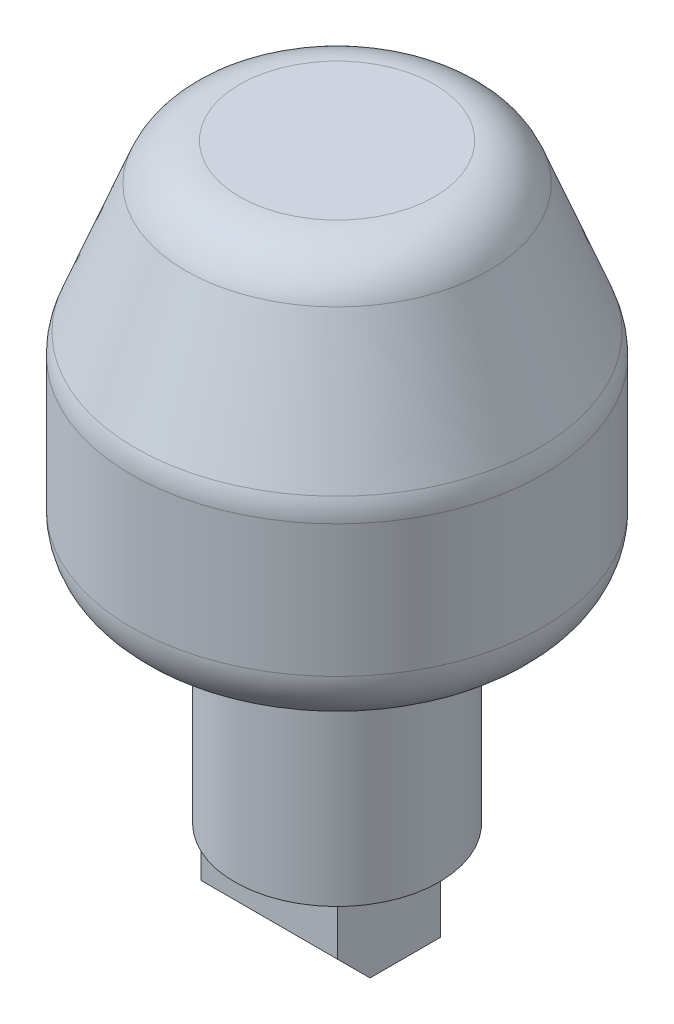
ISO-10303-21;
HEADER;
FILE_DESCRIPTION(('STEP AP214'),'2;1');
FILE_NAME('part.step','',(''),(''),'','','');
FILE_SCHEMA(('AUTOMOTIVE_DESIGN { 1 0 10303 214 1 1 1 1 }'));
ENDSEC;
DATA;
#1=APPLICATION_CONTEXT('core data for automotive mechanical design processes');
#2=APPLICATION_PROTOCOL_DEFINITION('international standard','automotive_design',2000,#1);
#3=PRODUCT_CONTEXT('',#1,'mechanical');
#4=PRODUCT('Part','Part','',(#3));
#5=PRODUCT_RELATED_PRODUCT_CATEGORY('part','',(#4));
#6=PRODUCT_DEFINITION_FORMATION('','',#4);
#7=PRODUCT_DEFINITION_CONTEXT('part definition',#1,'design');
#8=PRODUCT_DEFINITION('design','',#6,#7);
#9=PRODUCT_DEFINITION_SHAPE('','',#8);
#10=(LENGTH_UNIT() NAMED_UNIT(*) SI_UNIT(.MILLI.,.METRE.));
#11=(NAMED_UNIT(*) PLANE_ANGLE_UNIT() SI_UNIT($,.RADIAN.));
#12=(NAMED_UNIT(*) SI_UNIT($,.STERADIAN.) SOLID_ANGLE_UNIT());
#13=UNCERTAINTY_MEASURE_WITH_UNIT(LENGTH_MEASURE(1.E-05),#10,'distance_accuracy_value','');
#14=(GEOMETRIC_REPRESENTATION_CONTEXT(3) GLOBAL_UNCERTAINTY_ASSIGNED_CONTEXT((#13)) GLOBAL_UNIT_ASSIGNED_CONTEXT((#10,
#11,#12)) REPRESENTATION_CONTEXT('',''));
#15=CARTESIAN_POINT('',(0.,0.,0.));
#16=DIRECTION('',(0.,0.,1.));
#17=DIRECTION('',(1.,0.,0.));
#18=AXIS2_PLACEMENT_3D('',#15,#16,#17);
#19=CARTESIAN_POINT('',(0.,-23.4188,0.));
#20=DIRECTION('',(0.,-1.,0.));
#21=DIRECTION('',(0.,0.,-1.));
#22=AXIS2_PLACEMENT_3D('',#19,#20,#21);
#23=PLANE('',#22);
#24=CARTESIAN_POINT('',(0.,-23.4188,0.));
#25=DIRECTION('',(0.,-1.,0.));
#26=DIRECTION('',(0.,0.,-1.));
#27=AXIS2_PLACEMENT_3D('',#24,#25,#26);
#28=CIRCLE('',#27,11.176);
#29=CARTESIAN_POINT('',(0.,-23.4188,-11.176));
#30=VERTEX_POINT('',#29);
#31=EDGE_CURVE('E336',#30,#30,#28,.T.);
#32=ORIENTED_EDGE('',*,*,#31,.T.);
#33=EDGE_LOOP('',(#32));
#34=FACE_BOUND('',#33,.T.);
#35=DIRECTION('',(-1.,0.,0.));
#36=VECTOR('',#35,1.);
#37=CARTESIAN_POINT('',(-7.4549,-23.4188,7.4041));
#38=LINE('',#37,#36);
#39=CARTESIAN_POINT('',(7.4549,-23.4188,7.4041));
#40=VERTEX_POINT('',#39);
#41=CARTESIAN_POINT('',(-7.4549,-23.4188,7.4041));
#42=VERTEX_POINT('',#41);
#43=EDGE_CURVE('E320',#40,#42,#38,.T.);
#44=ORIENTED_EDGE('',*,*,#43,.F.);
#45=DIRECTION('',(0.,0.,1.));
#46=VECTOR('',#45,1.);
#47=CARTESIAN_POINT('',(7.4549,-23.4188,7.4041));
#48=LINE('',#47,#46);
#49=CARTESIAN_POINT('',(7.4549,-23.4188,-3.8481));
#50=VERTEX_POINT('',#49);
#51=EDGE_CURVE('E302',#50,#40,#48,.T.);
#52=ORIENTED_EDGE('',*,*,#51,.F.);
#53=DIRECTION('',(1.,0.,0.));
#54=VECTOR('',#53,1.);
#55=CARTESIAN_POINT('',(7.4549,-23.4188,-3.8481));
#56=LINE('',#55,#54);
#57=CARTESIAN_POINT('',(-7.4549,-23.4188,-3.8481));
#58=VERTEX_POINT('',#57);
#59=EDGE_CURVE('E313',#58,#50,#56,.T.);
#60=ORIENTED_EDGE('',*,*,#59,.F.);
#61=DIRECTION('',(0.,0.,-1.));
#62=VECTOR('',#61,1.);
#63=CARTESIAN_POINT('',(-7.4549,-23.4188,-3.8481));
#64=LINE('',#63,#62);
#65=EDGE_CURVE('E323',#42,#58,#64,.T.);
#66=ORIENTED_EDGE('',*,*,#65,.F.);
#67=EDGE_LOOP('',(#44,#52,#60,#66));
#68=FACE_BOUND('',#67,.T.);
#69=ADVANCED_FACE('F36',(#34,#68),#23,.T.);
#70=CARTESIAN_POINT('',(22.479,0.,0.));
#71=DIRECTION('',(0.,-1.,0.));
#72=DIRECTION('',(0.,0.,-1.));
#73=AXIS2_PLACEMENT_3D('',#70,#71,#72);
#74=PLANE('',#73);
#75=CARTESIAN_POINT('',(0.,0.,0.));
#76=DIRECTION('',(0.,-1.,0.));
#77=DIRECTION('',(0.,0.,-1.));
#78=AXIS2_PLACEMENT_3D('',#75,#76,#77);
#79=CIRCLE('',#78,16.129);
#80=CARTESIAN_POINT('',(0.,0.,-16.129));
#81=VERTEX_POINT('',#80);
#82=EDGE_CURVE('E44',#81,#81,#79,.T.);
#83=ORIENTED_EDGE('',*,*,#82,.T.);
#84=EDGE_LOOP('',(#83));
#85=FACE_BOUND('',#84,.T.);
#86=CARTESIAN_POINT('',(0.,0.,0.));
#87=DIRECTION('',(0.,-1.,0.));
#88=DIRECTION('',(0.,0.,-1.));
#89=AXIS2_PLACEMENT_3D('',#86,#87,#88);
#90=CIRCLE('',#89,11.176);
#91=CARTESIAN_POINT('',(-1.778,0.,11.0336617675185));
#92=VERTEX_POINT('',#91);
#93=CARTESIAN_POINT('',(1.778,0.,11.0336617675185));
#94=VERTEX_POINT('',#93);
#95=EDGE_CURVE('E335',#92,#94,#90,.T.);
#96=ORIENTED_EDGE('',*,*,#95,.F.);
#97=DIRECTION('',(0.,0.,1.));
#98=VECTOR('',#97,1.);
#99=CARTESIAN_POINT('',(-1.778,0.,0.));
#100=LINE('',#99,#98);
#101=CARTESIAN_POINT('',(-1.778,0.,14.2944088179873));
#102=VERTEX_POINT('',#101);
#103=EDGE_CURVE('E198',#92,#102,#100,.T.);
#104=ORIENTED_EDGE('',*,*,#103,.T.);
#105=DIRECTION('',(-1.,0.,0.));
#106=VECTOR('',#105,1.);
#107=CARTESIAN_POINT('',(22.479,0.,14.2944088179873));
#108=LINE('',#107,#106);
#109=CARTESIAN_POINT('',(1.778,0.,14.2944088179873));
#110=VERTEX_POINT('',#109);
#111=EDGE_CURVE('E210',#110,#102,#108,.T.);
#112=ORIENTED_EDGE('',*,*,#111,.F.);
#113=DIRECTION('',(0.,0.,1.));
#114=VECTOR('',#113,1.);
#115=CARTESIAN_POINT('',(1.778,0.,0.));
#116=LINE('',#115,#114);
#117=EDGE_CURVE('E186',#94,#110,#116,.T.);
#118=ORIENTED_EDGE('',*,*,#117,.F.);
#119=EDGE_LOOP('',(#96,#104,#112,#118));
#120=FACE_BOUND('',#119,.T.);
#121=ADVANCED_FACE('F368',(#85,#120),#74,.T.);
#122=CARTESIAN_POINT('',(0.,0.,0.));
#123=DIRECTION('',(0.,1.,0.));
#124=DIRECTION('',(0.,0.,1.));
#125=AXIS2_PLACEMENT_3D('',#122,#123,#124);
#126=CYLINDRICAL_SURFACE('',#125,22.479);
#127=CARTESIAN_POINT('',(0.,20.8013575067965,0.));
#128=DIRECTION('',(0.,-1.,0.));
#129=DIRECTION('',(0.,0.,-1.));
#130=AXIS2_PLACEMENT_3D('',#127,#128,#129);
#131=CIRCLE('',#130,22.479);
#132=CARTESIAN_POINT('',(0.,20.8013575067965,-22.479));
#133=VERTEX_POINT('',#132);
#134=EDGE_CURVE('E363',#133,#133,#131,.T.);
#135=ORIENTED_EDGE('',*,*,#134,.T.);
#136=EDGE_LOOP('',(#135));
#137=FACE_BOUND('',#136,.T.);
#138=CARTESIAN_POINT('',(0.,6.34999999999998,0.));
#139=DIRECTION('',(0.,-1.,0.));
#140=DIRECTION('',(0.,0.,-1.));
#141=AXIS2_PLACEMENT_3D('',#138,#139,#140);
#142=CIRCLE('',#141,22.479);
#143=CARTESIAN_POINT('',(0.,6.34999999999998,-22.479));
#144=VERTEX_POINT('',#143);
#145=EDGE_CURVE('E360',#144,#144,#142,.F.);
#146=ORIENTED_EDGE('',*,*,#145,.T.);
#147=EDGE_LOOP('',(#146));
#148=FACE_BOUND('',#147,.T.);
#149=ADVANCED_FACE('F377',(#137,#148),#126,.T.);
#150=CARTESIAN_POINT('',(0.,41.1988,0.));
#151=DIRECTION('',(0.,1.,0.));
#152=DIRECTION('',(0.,0.,1.));
#153=AXIS2_PLACEMENT_3D('',#150,#151,#152);
#154=PLANE('',#153);
#155=CARTESIAN_POINT('',(0.,41.1988,0.));
#156=DIRECTION('',(0.,1.,0.));
#157=DIRECTION('',(0.,0.,1.));
#158=AXIS2_PLACEMENT_3D('',#155,#156,#157);
#159=CIRCLE('',#158,10.6475245335533);
#160=CARTESIAN_POINT('',(0.,41.1988,10.6475245335533));
#161=VERTEX_POINT('',#160);
#162=EDGE_CURVE('E11',#161,#161,#159,.T.);
#163=ORIENTED_EDGE('',*,*,#162,.T.);
#164=EDGE_LOOP('',(#163));
#165=FACE_BOUND('',#164,.T.);
#166=ADVANCED_FACE('F379',(#165),#154,.T.);
#167=CARTESIAN_POINT('',(0.,41.1988,0.));
#168=DIRECTION('',(0.,-1.,0.));
#169=DIRECTION('',(0.,0.,-1.));
#170=AXIS2_PLACEMENT_3D('',#167,#168,#169);
#171=CONICAL_SURFACE('',#170,14.9860000721899,0.372039753430632);
#172=CARTESIAN_POINT('',(0.,23.1096866231787,0.));
#173=DIRECTION('',(0.,1.,0.));
#174=DIRECTION('',(0.,0.,1.));
#175=AXIS2_PLACEMENT_3D('',#172,#173,#174);
#176=CIRCLE('',#175,22.0445825317936);
#177=CARTESIAN_POINT('',(0.,23.1096866231787,22.0445825317936));
#178=VERTEX_POINT('',#177);
#179=EDGE_CURVE('E357',#178,#178,#176,.T.);
#180=ORIENTED_EDGE('',*,*,#179,.T.);
#181=EDGE_LOOP('',(#180));
#182=FACE_BOUND('',#181,.T.);
#183=CARTESIAN_POINT('',(0.,37.1571291163823,0.));
#184=DIRECTION('',(0.,1.,0.));
#185=DIRECTION('',(0.,0.,1.));
#186=AXIS2_PLACEMENT_3D('',#183,#184,#185);
#187=CIRCLE('',#186,16.5631070653469);
#188=CARTESIAN_POINT('',(0.,37.1571291163823,16.5631070653469));
#189=VERTEX_POINT('',#188);
#190=EDGE_CURVE('E354',#189,#189,#187,.F.);
#191=ORIENTED_EDGE('',*,*,#190,.T.);
#192=EDGE_LOOP('',(#191));
#193=FACE_BOUND('',#192,.T.);
#194=ADVANCED_FACE('F386',(#182,#193),#171,.T.);
#195=CARTESIAN_POINT('',(0.,-23.4188,0.));
#196=DIRECTION('',(0.,1.,0.));
#197=DIRECTION('',(0.,0.,1.));
#198=AXIS2_PLACEMENT_3D('',#195,#196,#197);
#199=CYLINDRICAL_SURFACE('',#198,11.176);
#200=DIRECTION('',(0.,1.,0.));
#201=VECTOR('',#200,1.);
#202=CARTESIAN_POINT('',(-1.778,-23.4188,11.0336617675185));
#203=LINE('',#202,#201);
#204=CARTESIAN_POINT('',(-1.778,-2.1844,11.0336617675185));
#205=VERTEX_POINT('',#204);
#206=EDGE_CURVE('E339',#92,#205,#203,.F.);
#207=ORIENTED_EDGE('',*,*,#206,.F.);
#208=ORIENTED_EDGE('',*,*,#95,.T.);
#209=DIRECTION('',(0.,1.,0.));
#210=VECTOR('',#209,1.);
#211=CARTESIAN_POINT('',(1.778,-23.4188,11.0336617675185));
#212=LINE('',#211,#210);
#213=CARTESIAN_POINT('',(1.778,-2.1844,11.0336617675185));
#214=VERTEX_POINT('',#213);
#215=EDGE_CURVE('E345',#94,#214,#212,.F.);
#216=ORIENTED_EDGE('',*,*,#215,.T.);
#217=CARTESIAN_POINT('',(0.,-2.1844,0.));
#218=DIRECTION('',(0.,-1.,0.));
#219=DIRECTION('',(0.,0.,-1.));
#220=AXIS2_PLACEMENT_3D('',#217,#218,#219);
#221=CIRCLE('',#220,11.176);
#222=EDGE_CURVE('E202',#214,#205,#221,.T.);
#223=ORIENTED_EDGE('',*,*,#222,.T.);
#224=EDGE_LOOP('',(#207,#208,#216,#223));
#225=FACE_BOUND('',#224,.T.);
#226=ORIENTED_EDGE('',*,*,#31,.F.);
#227=EDGE_LOOP('',(#226));
#228=FACE_BOUND('',#227,.T.);
#229=ADVANCED_FACE('F401',(#225,#228),#199,.T.);
#230=CARTESIAN_POINT('',(7.4549,-32.4358,7.4041));
#231=DIRECTION('',(-1.,0.,0.));
#232=DIRECTION('',(0.,0.,1.));
#233=AXIS2_PLACEMENT_3D('',#230,#231,#232);
#234=PLANE('',#233);
#235=DIRECTION('',(0.,1.,0.));
#236=VECTOR('',#235,1.);
#237=CARTESIAN_POINT('',(7.4549,-32.4358,7.4041));
#238=LINE('',#237,#236);
#239=CARTESIAN_POINT('',(7.4549,-28.8798,7.4041));
#240=VERTEX_POINT('',#239);
#241=EDGE_CURVE('E333',#240,#40,#238,.T.);
#242=ORIENTED_EDGE('',*,*,#241,.F.);
#243=DIRECTION('',(0.,0.70710678118655,0.707106781186545));
#244=VECTOR('',#243,1.);
#245=CARTESIAN_POINT('',(7.4549,-32.4358,3.84810000000004));
#246=LINE('',#245,#244);
#247=CARTESIAN_POINT('',(7.4549,-32.4358,3.84810000000004));
#248=VERTEX_POINT('',#247);
#249=EDGE_CURVE('E352',#240,#248,#246,.F.);
#250=ORIENTED_EDGE('',*,*,#249,.T.);
#251=DIRECTION('',(0.,0.,1.));
#252=VECTOR('',#251,1.);
#253=CARTESIAN_POINT('',(7.4549,-32.4358,7.4041));
#254=LINE('',#253,#252);
#255=CARTESIAN_POINT('',(7.4549,-32.4358,-3.8481));
#256=VERTEX_POINT('',#255);
#257=EDGE_CURVE('E309',#256,#248,#254,.T.);
#258=ORIENTED_EDGE('',*,*,#257,.F.);
#259=DIRECTION('',(0.,1.,0.));
#260=VECTOR('',#259,1.);
#261=CARTESIAN_POINT('',(7.4549,-32.4358,-3.8481));
#262=LINE('',#261,#260);
#263=EDGE_CURVE('E317',#256,#50,#262,.T.);
#264=ORIENTED_EDGE('',*,*,#263,.T.);
#265=ORIENTED_EDGE('',*,*,#51,.T.);
#266=EDGE_LOOP('',(#242,#250,#258,#264,#265));
#267=FACE_BOUND('',#266,.T.);
#268=ADVANCED_FACE('F399',(#267),#234,.F.);
#269=CARTESIAN_POINT('',(-7.4549,-32.4358,7.4041));
#270=DIRECTION('',(0.,0.,-1.));
#271=DIRECTION('',(0.,1.,0.));
#272=AXIS2_PLACEMENT_3D('',#269,#270,#271);
#273=PLANE('',#272);
#274=DIRECTION('',(0.,1.,0.));
#275=VECTOR('',#274,1.);
#276=CARTESIAN_POINT('',(-7.4549,-32.4358,7.4041));
#277=LINE('',#276,#275);
#278=CARTESIAN_POINT('',(-7.4549,-28.8798,7.4041));
#279=VERTEX_POINT('',#278);
#280=EDGE_CURVE('E331',#279,#42,#277,.T.);
#281=ORIENTED_EDGE('',*,*,#280,.F.);
#282=DIRECTION('',(1.,0.,0.));
#283=VECTOR('',#282,1.);
#284=CARTESIAN_POINT('',(-7.4549,-28.8798,7.4041));
#285=LINE('',#284,#283);
#286=EDGE_CURVE('E51',#279,#240,#285,.T.);
#287=ORIENTED_EDGE('',*,*,#286,.T.);
#288=ORIENTED_EDGE('',*,*,#241,.T.);
#289=ORIENTED_EDGE('',*,*,#43,.T.);
#290=EDGE_LOOP('',(#281,#287,#288,#289));
#291=FACE_BOUND('',#290,.T.);
#292=ADVANCED_FACE('F609',(#291),#273,.F.);
#293=CARTESIAN_POINT('',(-7.4549,-32.4358,-3.8481));
#294=DIRECTION('',(1.,0.,0.));
#295=DIRECTION('',(0.,0.,-1.));
#296=AXIS2_PLACEMENT_3D('',#293,#294,#295);
#297=PLANE('',#296);
#298=DIRECTION('',(0.,0.,-1.));
#299=VECTOR('',#298,1.);
#300=CARTESIAN_POINT('',(-7.4549,-32.4358,-3.8481));
#301=LINE('',#300,#299);
#302=CARTESIAN_POINT('',(-7.4549,-32.4358,3.84810000000004));
#303=VERTEX_POINT('',#302);
#304=CARTESIAN_POINT('',(-7.4549,-32.4358,-3.8481));
#305=VERTEX_POINT('',#304);
#306=EDGE_CURVE('E312',#303,#305,#301,.T.);
#307=ORIENTED_EDGE('',*,*,#306,.F.);
#308=DIRECTION('',(0.,-0.70710678118655,-0.707106781186545));
#309=VECTOR('',#308,1.);
#310=CARTESIAN_POINT('',(-7.4549,-32.4358,3.84810000000004));
#311=LINE('',#310,#309);
#312=EDGE_CURVE('E59',#303,#279,#311,.F.);
#313=ORIENTED_EDGE('',*,*,#312,.T.);
#314=ORIENTED_EDGE('',*,*,#280,.T.);
#315=ORIENTED_EDGE('',*,*,#65,.T.);
#316=DIRECTION('',(0.,1.,0.));
#317=VECTOR('',#316,1.);
#318=CARTESIAN_POINT('',(-7.4549,-32.4358,-3.8481));
#319=LINE('',#318,#317);
#320=EDGE_CURVE('E329',#305,#58,#319,.T.);
#321=ORIENTED_EDGE('',*,*,#320,.F.);
#322=EDGE_LOOP('',(#307,#313,#314,#315,#321));
#323=FACE_BOUND('',#322,.T.);
#324=ADVANCED_FACE('F602',(#323),#297,.F.);
#325=CARTESIAN_POINT('',(7.4549,-32.4358,-3.8481));
#326=DIRECTION('',(0.,0.,1.));
#327=DIRECTION('',(0.,-1.,0.));
#328=AXIS2_PLACEMENT_3D('',#325,#326,#327);
#329=PLANE('',#328);
#330=ORIENTED_EDGE('',*,*,#59,.T.);
#331=ORIENTED_EDGE('',*,*,#263,.F.);
#332=DIRECTION('',(1.,0.,0.));
#333=VECTOR('',#332,1.);
#334=CARTESIAN_POINT('',(7.4549,-32.4358,-3.8481));
#335=LINE('',#334,#333);
#336=EDGE_CURVE('E315',#305,#256,#335,.T.);
#337=ORIENTED_EDGE('',*,*,#336,.F.);
#338=ORIENTED_EDGE('',*,*,#320,.T.);
#339=EDGE_LOOP('',(#330,#331,#337,#338));
#340=FACE_BOUND('',#339,.T.);
#341=ADVANCED_FACE('F594',(#340),#329,.F.);
#342=CARTESIAN_POINT('',(7.4549,-32.4358,-3.8481));
#343=DIRECTION('',(0.,1.,0.));
#344=DIRECTION('',(0.,0.,1.));
#345=AXIS2_PLACEMENT_3D('',#342,#343,#344);
#346=PLANE('',#345);
#347=DIRECTION('',(-1.,0.,0.));
#348=VECTOR('',#347,1.);
#349=CARTESIAN_POINT('',(7.30958053593167,-32.4358,3.71194026797607));
#350=LINE('',#349,#348);
#351=CARTESIAN_POINT('',(7.30958053593167,-32.4358,3.71194026797607));
#352=VERTEX_POINT('',#351);
#353=CARTESIAN_POINT('',(2.54846666666666,-32.4358,3.71194026797607));
#354=VERTEX_POINT('',#353);
#355=EDGE_CURVE('E228',#352,#354,#350,.T.);
#356=ORIENTED_EDGE('',*,*,#355,.F.);
#357=DIRECTION('',(0.,0.,1.));
#358=VECTOR('',#357,1.);
#359=CARTESIAN_POINT('',(7.30958053593168,-32.4358,-3.71194026804881));
#360=LINE('',#359,#358);
#361=CARTESIAN_POINT('',(7.30958053593168,-32.4358,-3.71194026804881));
#362=VERTEX_POINT('',#361);
#363=EDGE_CURVE('E212',#362,#352,#360,.T.);
#364=ORIENTED_EDGE('',*,*,#363,.F.);
#365=DIRECTION('',(1.,0.,0.));
#366=VECTOR('',#365,1.);
#367=CARTESIAN_POINT('',(2.54846666666666,-32.4358,-3.71194026804881));
#368=LINE('',#367,#366);
#369=CARTESIAN_POINT('',(2.54846666666666,-32.4358,-3.71194026804881));
#370=VERTEX_POINT('',#369);
#371=EDGE_CURVE('E217',#370,#362,#368,.T.);
#372=ORIENTED_EDGE('',*,*,#371,.F.);
#373=DIRECTION('',(0.,0.,-1.));
#374=VECTOR('',#373,1.);
#375=CARTESIAN_POINT('',(2.54846666666666,-32.4358,3.71194026797607));
#376=LINE('',#375,#374);
#377=EDGE_CURVE('E231',#354,#370,#376,.T.);
#378=ORIENTED_EDGE('',*,*,#377,.F.);
#379=EDGE_LOOP('',(#356,#364,#372,#378));
#380=FACE_BOUND('',#379,.T.);
#381=DIRECTION('',(1.,0.,0.));
#382=VECTOR('',#381,1.);
#383=CARTESIAN_POINT('',(-7.3279,-32.4358,-3.71194026804881));
#384=LINE('',#383,#382);
#385=CARTESIAN_POINT('',(-7.3279,-32.4358,-3.71194026804881));
#386=VERTEX_POINT('',#385);
#387=CARTESIAN_POINT('',(-2.54846666666666,-32.4358,-3.71194026804881));
#388=VERTEX_POINT('',#387);
#389=EDGE_CURVE('E260',#386,#388,#384,.T.);
#390=ORIENTED_EDGE('',*,*,#389,.F.);
#391=DIRECTION('',(0.,0.,-1.));
#392=VECTOR('',#391,1.);
#393=CARTESIAN_POINT('',(-7.3279,-32.4358,3.71194026797607));
#394=LINE('',#393,#392);
#395=CARTESIAN_POINT('',(-7.3279,-32.4358,3.71194026797607));
#396=VERTEX_POINT('',#395);
#397=EDGE_CURVE('E238',#396,#386,#394,.T.);
#398=ORIENTED_EDGE('',*,*,#397,.F.);
#399=DIRECTION('',(-1.,0.,0.));
#400=VECTOR('',#399,1.);
#401=CARTESIAN_POINT('',(-2.54846666666666,-32.4358,3.71194026797607));
#402=LINE('',#401,#400);
#403=CARTESIAN_POINT('',(-2.54846666666666,-32.4358,3.71194026797607));
#404=VERTEX_POINT('',#403);
#405=EDGE_CURVE('E249',#404,#396,#402,.T.);
#406=ORIENTED_EDGE('',*,*,#405,.F.);
#407=DIRECTION('',(0.,0.,1.));
#408=VECTOR('',#407,1.);
#409=CARTESIAN_POINT('',(-2.54846666666666,-32.4358,-3.71194026804881));
#410=LINE('',#409,#408);
#411=EDGE_CURVE('E263',#388,#404,#410,.T.);
#412=ORIENTED_EDGE('',*,*,#411,.F.);
#413=EDGE_LOOP('',(#390,#398,#406,#412));
#414=FACE_BOUND('',#413,.T.);
#415=DIRECTION('',(-1.,0.,0.));
#416=VECTOR('',#415,1.);
#417=CARTESIAN_POINT('',(2.42146666666666,-32.4358,3.71194026797607));
#418=LINE('',#417,#416);
#419=CARTESIAN_POINT('',(2.42146666666666,-32.4358,3.71194026797607));
#420=VERTEX_POINT('',#419);
#421=CARTESIAN_POINT('',(-2.42146666666666,-32.4358,3.71194026797607));
#422=VERTEX_POINT('',#421);
#423=EDGE_CURVE('E292',#420,#422,#418,.T.);
#424=ORIENTED_EDGE('',*,*,#423,.F.);
#425=DIRECTION('',(0.,0.,1.));
#426=VECTOR('',#425,1.);
#427=CARTESIAN_POINT('',(2.42146666666666,-32.4358,-3.71194026804881));
#428=LINE('',#427,#426);
#429=CARTESIAN_POINT('',(2.42146666666666,-32.4358,-3.71194026804881));
#430=VERTEX_POINT('',#429);
#431=EDGE_CURVE('E270',#430,#420,#428,.T.);
#432=ORIENTED_EDGE('',*,*,#431,.F.);
#433=DIRECTION('',(1.,0.,0.));
#434=VECTOR('',#433,1.);
#435=CARTESIAN_POINT('',(-2.42146666666666,-32.4358,-3.71194026804881));
#436=LINE('',#435,#434);
#437=CARTESIAN_POINT('',(-2.42146666666666,-32.4358,-3.71194026804881));
#438=VERTEX_POINT('',#437);
#439=EDGE_CURVE('E281',#438,#430,#436,.T.);
#440=ORIENTED_EDGE('',*,*,#439,.F.);
#441=DIRECTION('',(0.,0.,-1.));
#442=VECTOR('',#441,1.);
#443=CARTESIAN_POINT('',(-2.42146666666666,-32.4358,3.71194026797607));
#444=LINE('',#443,#442);
#445=EDGE_CURVE('E295',#422,#438,#444,.T.);
#446=ORIENTED_EDGE('',*,*,#445,.F.);
#447=EDGE_LOOP('',(#424,#432,#440,#446));
#448=FACE_BOUND('',#447,.T.);
#449=ORIENTED_EDGE('',*,*,#257,.T.);
#450=DIRECTION('',(-1.,0.,0.));
#451=VECTOR('',#450,1.);
#452=CARTESIAN_POINT('',(7.4549,-32.4358,3.84810000000004));
#453=LINE('',#452,#451);
#454=EDGE_CURVE('E347',#248,#303,#453,.T.);
#455=ORIENTED_EDGE('',*,*,#454,.T.);
#456=ORIENTED_EDGE('',*,*,#306,.T.);
#457=ORIENTED_EDGE('',*,*,#336,.T.);
#458=EDGE_LOOP('',(#449,#455,#456,#457));
#459=FACE_BOUND('',#458,.T.);
#460=ADVANCED_FACE('F586',(#380,#414,#448,#459),#346,.F.);
#461=CARTESIAN_POINT('',(2.42146666666666,-29.8958,-3.71194026804881));
#462=DIRECTION('',(1.,0.,0.));
#463=DIRECTION('',(0.,0.,-1.));
#464=AXIS2_PLACEMENT_3D('',#461,#462,#463);
#465=PLANE('',#464);
#466=ORIENTED_EDGE('',*,*,#431,.T.);
#467=DIRECTION('',(0.,-1.,0.));
#468=VECTOR('',#467,1.);
#469=CARTESIAN_POINT('',(2.42146666666666,-29.8958,3.71194026797607));
#470=LINE('',#469,#468);
#471=CARTESIAN_POINT('',(2.42146666666666,-29.8958,3.71194026797607));
#472=VERTEX_POINT('',#471);
#473=EDGE_CURVE('E290',#472,#420,#470,.T.);
#474=ORIENTED_EDGE('',*,*,#473,.F.);
#475=DIRECTION('',(0.,0.,1.));
#476=VECTOR('',#475,1.);
#477=CARTESIAN_POINT('',(2.42146666666666,-29.8958,-3.71194026804881));
#478=LINE('',#477,#476);
#479=CARTESIAN_POINT('',(2.42146666666666,-29.8958,-3.71194026804881));
#480=VERTEX_POINT('',#479);
#481=EDGE_CURVE('E277',#480,#472,#478,.T.);
#482=ORIENTED_EDGE('',*,*,#481,.F.);
#483=DIRECTION('',(0.,-1.,0.));
#484=VECTOR('',#483,1.);
#485=CARTESIAN_POINT('',(2.42146666666666,-29.8958,-3.71194026804881));
#486=LINE('',#485,#484);
#487=EDGE_CURVE('E300',#480,#430,#486,.T.);
#488=ORIENTED_EDGE('',*,*,#487,.T.);
#489=EDGE_LOOP('',(#466,#474,#482,#488));
#490=FACE_BOUND('',#489,.T.);
#491=ADVANCED_FACE('F578',(#490),#465,.F.);
#492=CARTESIAN_POINT('',(-2.42146666666666,-29.8958,-3.71194026804881));
#493=DIRECTION('',(0.,0.,-1.));
#494=DIRECTION('',(-1.,0.,0.));
#495=AXIS2_PLACEMENT_3D('',#492,#493,#494);
#496=PLANE('',#495);
#497=ORIENTED_EDGE('',*,*,#439,.T.);
#498=ORIENTED_EDGE('',*,*,#487,.F.);
#499=DIRECTION('',(1.,0.,0.));
#500=VECTOR('',#499,1.);
#501=CARTESIAN_POINT('',(-2.42146666666666,-29.8958,-3.71194026804881));
#502=LINE('',#501,#500);
#503=CARTESIAN_POINT('',(-2.42146666666666,-29.8958,-3.71194026804881));
#504=VERTEX_POINT('',#503);
#505=EDGE_CURVE('E287',#504,#480,#502,.T.);
#506=ORIENTED_EDGE('',*,*,#505,.F.);
#507=DIRECTION('',(0.,-1.,0.));
#508=VECTOR('',#507,1.);
#509=CARTESIAN_POINT('',(-2.42146666666666,-29.8958,-3.71194026804881));
#510=LINE('',#509,#508);
#511=EDGE_CURVE('E303',#504,#438,#510,.T.);
#512=ORIENTED_EDGE('',*,*,#511,.T.);
#513=EDGE_LOOP('',(#497,#498,#506,#512));
#514=FACE_BOUND('',#513,.T.);
#515=ADVANCED_FACE('F570',(#514),#496,.F.);
#516=CARTESIAN_POINT('',(-2.42146666666666,-29.8958,3.71194026797607));
#517=DIRECTION('',(-1.,0.,0.));
#518=DIRECTION('',(0.,0.,1.));
#519=AXIS2_PLACEMENT_3D('',#516,#517,#518);
#520=PLANE('',#519);
#521=ORIENTED_EDGE('',*,*,#445,.T.);
#522=ORIENTED_EDGE('',*,*,#511,.F.);
#523=DIRECTION('',(0.,0.,-1.));
#524=VECTOR('',#523,1.);
#525=CARTESIAN_POINT('',(-2.42146666666666,-29.8958,3.71194026797607));
#526=LINE('',#525,#524);
#527=CARTESIAN_POINT('',(-2.42146666666666,-29.8958,3.71194026797607));
#528=VERTEX_POINT('',#527);
#529=EDGE_CURVE('E284',#528,#504,#526,.T.);
#530=ORIENTED_EDGE('',*,*,#529,.F.);
#531=DIRECTION('',(0.,-1.,0.));
#532=VECTOR('',#531,1.);
#533=CARTESIAN_POINT('',(-2.42146666666666,-29.8958,3.71194026797607));
#534=LINE('',#533,#532);
#535=EDGE_CURVE('E305',#528,#422,#534,.T.);
#536=ORIENTED_EDGE('',*,*,#535,.T.);
#537=EDGE_LOOP('',(#521,#522,#530,#536));
#538=FACE_BOUND('',#537,.T.);
#539=ADVANCED_FACE('F562',(#538),#520,.F.);
#540=CARTESIAN_POINT('',(2.42146666666666,-29.8958,3.71194026797607));
#541=DIRECTION('',(0.,0.,1.));
#542=DIRECTION('',(1.,0.,0.));
#543=AXIS2_PLACEMENT_3D('',#540,#541,#542);
#544=PLANE('',#543);
#545=ORIENTED_EDGE('',*,*,#423,.T.);
#546=ORIENTED_EDGE('',*,*,#535,.F.);
#547=DIRECTION('',(-1.,0.,0.));
#548=VECTOR('',#547,1.);
#549=CARTESIAN_POINT('',(2.42146666666666,-29.8958,3.71194026797607));
#550=LINE('',#549,#548);
#551=EDGE_CURVE('E280',#472,#528,#550,.T.);
#552=ORIENTED_EDGE('',*,*,#551,.F.);
#553=ORIENTED_EDGE('',*,*,#473,.T.);
#554=EDGE_LOOP('',(#545,#546,#552,#553));
#555=FACE_BOUND('',#554,.T.);
#556=ADVANCED_FACE('F554',(#555),#544,.F.);
#557=CARTESIAN_POINT('',(2.42146666666666,-29.8958,3.71194026797607));
#558=DIRECTION('',(0.,-1.,0.));
#559=DIRECTION('',(0.,0.,-1.));
#560=AXIS2_PLACEMENT_3D('',#557,#558,#559);
#561=PLANE('',#560);
#562=ORIENTED_EDGE('',*,*,#481,.T.);
#563=ORIENTED_EDGE('',*,*,#551,.T.);
#564=ORIENTED_EDGE('',*,*,#529,.T.);
#565=ORIENTED_EDGE('',*,*,#505,.T.);
#566=EDGE_LOOP('',(#562,#563,#564,#565));
#567=FACE_BOUND('',#566,.T.);
#568=ADVANCED_FACE('F546',(#567),#561,.T.);
#569=CARTESIAN_POINT('',(-7.3279,-29.8958,3.71194026797607));
#570=DIRECTION('',(-1.,0.,0.));
#571=DIRECTION('',(0.,0.,1.));
#572=AXIS2_PLACEMENT_3D('',#569,#570,#571);
#573=PLANE('',#572);
#574=ORIENTED_EDGE('',*,*,#397,.T.);
#575=DIRECTION('',(0.,-1.,0.));
#576=VECTOR('',#575,1.);
#577=CARTESIAN_POINT('',(-7.3279,-29.8958,-3.71194026804881));
#578=LINE('',#577,#576);
#579=CARTESIAN_POINT('',(-7.3279,-29.8958,-3.71194026804881));
#580=VERTEX_POINT('',#579);
#581=EDGE_CURVE('E258',#580,#386,#578,.T.);
#582=ORIENTED_EDGE('',*,*,#581,.F.);
#583=DIRECTION('',(0.,0.,-1.));
#584=VECTOR('',#583,1.);
#585=CARTESIAN_POINT('',(-7.3279,-29.8958,3.71194026797607));
#586=LINE('',#585,#584);
#587=CARTESIAN_POINT('',(-7.3279,-29.8958,3.71194026797607));
#588=VERTEX_POINT('',#587);
#589=EDGE_CURVE('E245',#588,#580,#586,.T.);
#590=ORIENTED_EDGE('',*,*,#589,.F.);
#591=DIRECTION('',(0.,-1.,0.));
#592=VECTOR('',#591,1.);
#593=CARTESIAN_POINT('',(-7.3279,-29.8958,3.71194026797607));
#594=LINE('',#593,#592);
#595=EDGE_CURVE('E268',#588,#396,#594,.T.);
#596=ORIENTED_EDGE('',*,*,#595,.T.);
#597=EDGE_LOOP('',(#574,#582,#590,#596));
#598=FACE_BOUND('',#597,.T.);
#599=ADVANCED_FACE('F538',(#598),#573,.F.);
#600=CARTESIAN_POINT('',(-2.54846666666666,-29.8958,3.71194026797607));
#601=DIRECTION('',(0.,0.,1.));
#602=DIRECTION('',(1.,0.,0.));
#603=AXIS2_PLACEMENT_3D('',#600,#601,#602);
#604=PLANE('',#603);
#605=ORIENTED_EDGE('',*,*,#405,.T.);
#606=ORIENTED_EDGE('',*,*,#595,.F.);
#607=DIRECTION('',(-1.,0.,0.));
#608=VECTOR('',#607,1.);
#609=CARTESIAN_POINT('',(-2.54846666666666,-29.8958,3.71194026797607));
#610=LINE('',#609,#608);
#611=CARTESIAN_POINT('',(-2.54846666666666,-29.8958,3.71194026797607));
#612=VERTEX_POINT('',#611);
#613=EDGE_CURVE('E255',#612,#588,#610,.T.);
#614=ORIENTED_EDGE('',*,*,#613,.F.);
#615=DIRECTION('',(0.,-1.,0.));
#616=VECTOR('',#615,1.);
#617=CARTESIAN_POINT('',(-2.54846666666666,-29.8958,3.71194026797607));
#618=LINE('',#617,#616);
#619=EDGE_CURVE('E271',#612,#404,#618,.T.);
#620=ORIENTED_EDGE('',*,*,#619,.T.);
#621=EDGE_LOOP('',(#605,#606,#614,#620));
#622=FACE_BOUND('',#621,.T.);
#623=ADVANCED_FACE('F530',(#622),#604,.F.);
#624=CARTESIAN_POINT('',(-2.54846666666666,-29.8958,-3.71194026804881));
#625=DIRECTION('',(1.,0.,0.));
#626=DIRECTION('',(0.,0.,-1.));
#627=AXIS2_PLACEMENT_3D('',#624,#625,#626);
#628=PLANE('',#627);
#629=ORIENTED_EDGE('',*,*,#411,.T.);
#630=ORIENTED_EDGE('',*,*,#619,.F.);
#631=DIRECTION('',(0.,0.,1.));
#632=VECTOR('',#631,1.);
#633=CARTESIAN_POINT('',(-2.54846666666666,-29.8958,-3.71194026804881));
#634=LINE('',#633,#632);
#635=CARTESIAN_POINT('',(-2.54846666666666,-29.8958,-3.71194026804881));
#636=VERTEX_POINT('',#635);
#637=EDGE_CURVE('E252',#636,#612,#634,.T.);
#638=ORIENTED_EDGE('',*,*,#637,.F.);
#639=DIRECTION('',(0.,-1.,0.));
#640=VECTOR('',#639,1.);
#641=CARTESIAN_POINT('',(-2.54846666666666,-29.8958,-3.71194026804881));
#642=LINE('',#641,#640);
#643=EDGE_CURVE('E273',#636,#388,#642,.T.);
#644=ORIENTED_EDGE('',*,*,#643,.T.);
#645=EDGE_LOOP('',(#629,#630,#638,#644));
#646=FACE_BOUND('',#645,.T.);
#647=ADVANCED_FACE('F522',(#646),#628,.F.);
#648=CARTESIAN_POINT('',(-7.3279,-29.8958,-3.71194026804881));
#649=DIRECTION('',(0.,0.,-1.));
#650=DIRECTION('',(-1.,0.,0.));
#651=AXIS2_PLACEMENT_3D('',#648,#649,#650);
#652=PLANE('',#651);
#653=ORIENTED_EDGE('',*,*,#389,.T.);
#654=ORIENTED_EDGE('',*,*,#643,.F.);
#655=DIRECTION('',(1.,0.,0.));
#656=VECTOR('',#655,1.);
#657=CARTESIAN_POINT('',(-7.3279,-29.8958,-3.71194026804881));
#658=LINE('',#657,#656);
#659=EDGE_CURVE('E248',#580,#636,#658,.T.);
#660=ORIENTED_EDGE('',*,*,#659,.F.);
#661=ORIENTED_EDGE('',*,*,#581,.T.);
#662=EDGE_LOOP('',(#653,#654,#660,#661));
#663=FACE_BOUND('',#662,.T.);
#664=ADVANCED_FACE('F514',(#663),#652,.F.);
#665=CARTESIAN_POINT('',(-7.3279,-29.8958,-3.71194026804881));
#666=DIRECTION('',(0.,-1.,0.));
#667=DIRECTION('',(0.,0.,-1.));
#668=AXIS2_PLACEMENT_3D('',#665,#666,#667);
#669=PLANE('',#668);
#670=ORIENTED_EDGE('',*,*,#589,.T.);
#671=ORIENTED_EDGE('',*,*,#659,.T.);
#672=ORIENTED_EDGE('',*,*,#637,.T.);
#673=ORIENTED_EDGE('',*,*,#613,.T.);
#674=EDGE_LOOP('',(#670,#671,#672,#673));
#675=FACE_BOUND('',#674,.T.);
#676=ADVANCED_FACE('F506',(#675),#669,.T.);
#677=CARTESIAN_POINT('',(7.30958053593168,-29.8958,-3.71194026804881));
#678=DIRECTION('',(1.,0.,0.));
#679=DIRECTION('',(0.,0.,-1.));
#680=AXIS2_PLACEMENT_3D('',#677,#678,#679);
#681=PLANE('',#680);
#682=ORIENTED_EDGE('',*,*,#363,.T.);
#683=DIRECTION('',(0.,-1.,0.));
#684=VECTOR('',#683,1.);
#685=CARTESIAN_POINT('',(7.30958053593167,-29.8958,3.71194026797607));
#686=LINE('',#685,#684);
#687=CARTESIAN_POINT('',(7.30958053593167,-29.8958,3.71194026797607));
#688=VERTEX_POINT('',#687);
#689=EDGE_CURVE('E226',#688,#352,#686,.T.);
#690=ORIENTED_EDGE('',*,*,#689,.F.);
#691=DIRECTION('',(0.,0.,1.));
#692=VECTOR('',#691,1.);
#693=CARTESIAN_POINT('',(7.30958053593168,-29.8958,-3.71194026804881));
#694=LINE('',#693,#692);
#695=CARTESIAN_POINT('',(7.30958053593168,-29.8958,-3.71194026804881));
#696=VERTEX_POINT('',#695);
#697=EDGE_CURVE('E213',#696,#688,#694,.T.);
#698=ORIENTED_EDGE('',*,*,#697,.F.);
#699=DIRECTION('',(0.,-1.,0.));
#700=VECTOR('',#699,1.);
#701=CARTESIAN_POINT('',(7.30958053593168,-29.8958,-3.71194026804881));
#702=LINE('',#701,#700);
#703=EDGE_CURVE('E236',#696,#362,#702,.T.);
#704=ORIENTED_EDGE('',*,*,#703,.T.);
#705=EDGE_LOOP('',(#682,#690,#698,#704));
#706=FACE_BOUND('',#705,.T.);
#707=ADVANCED_FACE('F498',(#706),#681,.F.);
#708=CARTESIAN_POINT('',(2.54846666666666,-29.8958,-3.71194026804881));
#709=DIRECTION('',(0.,0.,-1.));
#710=DIRECTION('',(-1.,0.,0.));
#711=AXIS2_PLACEMENT_3D('',#708,#709,#710);
#712=PLANE('',#711);
#713=ORIENTED_EDGE('',*,*,#371,.T.);
#714=ORIENTED_EDGE('',*,*,#703,.F.);
#715=DIRECTION('',(1.,0.,0.));
#716=VECTOR('',#715,1.);
#717=CARTESIAN_POINT('',(2.54846666666666,-29.8958,-3.71194026804881));
#718=LINE('',#717,#716);
#719=CARTESIAN_POINT('',(2.54846666666666,-29.8958,-3.71194026804881));
#720=VERTEX_POINT('',#719);
#721=EDGE_CURVE('E223',#720,#696,#718,.T.);
#722=ORIENTED_EDGE('',*,*,#721,.F.);
#723=DIRECTION('',(0.,-1.,0.));
#724=VECTOR('',#723,1.);
#725=CARTESIAN_POINT('',(2.54846666666666,-29.8958,-3.71194026804881));
#726=LINE('',#725,#724);
#727=EDGE_CURVE('E239',#720,#370,#726,.T.);
#728=ORIENTED_EDGE('',*,*,#727,.T.);
#729=EDGE_LOOP('',(#713,#714,#722,#728));
#730=FACE_BOUND('',#729,.T.);
#731=ADVANCED_FACE('F490',(#730),#712,.F.);
#732=CARTESIAN_POINT('',(2.54846666666666,-29.8958,3.71194026797607));
#733=DIRECTION('',(-1.,0.,0.));
#734=DIRECTION('',(0.,0.,1.));
#735=AXIS2_PLACEMENT_3D('',#732,#733,#734);
#736=PLANE('',#735);
#737=ORIENTED_EDGE('',*,*,#377,.T.);
#738=ORIENTED_EDGE('',*,*,#727,.F.);
#739=DIRECTION('',(0.,0.,-1.));
#740=VECTOR('',#739,1.);
#741=CARTESIAN_POINT('',(2.54846666666666,-29.8958,3.71194026797607));
#742=LINE('',#741,#740);
#743=CARTESIAN_POINT('',(2.54846666666666,-29.8958,3.71194026797607));
#744=VERTEX_POINT('',#743);
#745=EDGE_CURVE('E220',#744,#720,#742,.T.);
#746=ORIENTED_EDGE('',*,*,#745,.F.);
#747=DIRECTION('',(0.,-1.,0.));
#748=VECTOR('',#747,1.);
#749=CARTESIAN_POINT('',(2.54846666666666,-29.8958,3.71194026797607));
#750=LINE('',#749,#748);
#751=EDGE_CURVE('E241',#744,#354,#750,.T.);
#752=ORIENTED_EDGE('',*,*,#751,.T.);
#753=EDGE_LOOP('',(#737,#738,#746,#752));
#754=FACE_BOUND('',#753,.T.);
#755=ADVANCED_FACE('F482',(#754),#736,.F.);
#756=CARTESIAN_POINT('',(7.30958053593167,-29.8958,3.71194026797607));
#757=DIRECTION('',(0.,0.,1.));
#758=DIRECTION('',(1.,0.,0.));
#759=AXIS2_PLACEMENT_3D('',#756,#757,#758);
#760=PLANE('',#759);
#761=ORIENTED_EDGE('',*,*,#355,.T.);
#762=ORIENTED_EDGE('',*,*,#751,.F.);
#763=DIRECTION('',(-1.,0.,0.));
#764=VECTOR('',#763,1.);
#765=CARTESIAN_POINT('',(7.30958053593167,-29.8958,3.71194026797607));
#766=LINE('',#765,#764);
#767=EDGE_CURVE('E216',#688,#744,#766,.T.);
#768=ORIENTED_EDGE('',*,*,#767,.F.);
#769=ORIENTED_EDGE('',*,*,#689,.T.);
#770=EDGE_LOOP('',(#761,#762,#768,#769));
#771=FACE_BOUND('',#770,.T.);
#772=ADVANCED_FACE('F474',(#771),#760,.F.);
#773=CARTESIAN_POINT('',(7.30958053593167,-29.8958,3.71194026797607));
#774=DIRECTION('',(0.,-1.,0.));
#775=DIRECTION('',(0.,0.,-1.));
#776=AXIS2_PLACEMENT_3D('',#773,#774,#775);
#777=PLANE('',#776);
#778=ORIENTED_EDGE('',*,*,#697,.T.);
#779=ORIENTED_EDGE('',*,*,#767,.T.);
#780=ORIENTED_EDGE('',*,*,#745,.T.);
#781=ORIENTED_EDGE('',*,*,#721,.T.);
#782=EDGE_LOOP('',(#778,#779,#780,#781));
#783=FACE_BOUND('',#782,.T.);
#784=ADVANCED_FACE('F466',(#783),#777,.T.);
#785=CARTESIAN_POINT('',(0.,0.,14.2944088179873));
#786=DIRECTION('',(0.,0.,1.));
#787=DIRECTION('',(0.,-1.,0.));
#788=AXIS2_PLACEMENT_3D('',#785,#786,#787);
#789=PLANE('',#788);
#790=DIRECTION('',(0.,1.,0.));
#791=VECTOR('',#790,1.);
#792=CARTESIAN_POINT('',(1.778,4.3815,14.2944088179873));
#793=LINE('',#792,#791);
#794=CARTESIAN_POINT('',(1.778,-2.1844,14.2944088179873));
#795=VERTEX_POINT('',#794);
#796=EDGE_CURVE('E180',#110,#795,#793,.F.);
#797=ORIENTED_EDGE('',*,*,#796,.F.);
#798=ORIENTED_EDGE('',*,*,#111,.T.);
#799=DIRECTION('',(0.,1.,0.));
#800=VECTOR('',#799,1.);
#801=CARTESIAN_POINT('',(-1.778,4.3815,14.2944088179873));
#802=LINE('',#801,#800);
#803=CARTESIAN_POINT('',(-1.778,-2.1844,14.2944088179873));
#804=VERTEX_POINT('',#803);
#805=EDGE_CURVE('E194',#102,#804,#802,.F.);
#806=ORIENTED_EDGE('',*,*,#805,.T.);
#807=DIRECTION('',(1.,0.,0.));
#808=VECTOR('',#807,1.);
#809=CARTESIAN_POINT('',(0.,-2.1844,14.2944088179873));
#810=LINE('',#809,#808);
#811=EDGE_CURVE('E189',#804,#795,#810,.T.);
#812=ORIENTED_EDGE('',*,*,#811,.T.);
#813=EDGE_LOOP('',(#797,#798,#806,#812));
#814=FACE_BOUND('',#813,.T.);
#815=ADVANCED_FACE('F192',(#814),#789,.T.);
#816=CARTESIAN_POINT('',(0.,-2.1844,14.2944088179873));
#817=DIRECTION('',(0.,-1.,0.));
#818=DIRECTION('',(0.,0.,-1.));
#819=AXIS2_PLACEMENT_3D('',#816,#817,#818);
#820=PLANE('',#819);
#821=ORIENTED_EDGE('',*,*,#222,.F.);
#822=DIRECTION('',(0.,0.,-1.));
#823=VECTOR('',#822,1.);
#824=CARTESIAN_POINT('',(1.778,-2.1844,0.));
#825=LINE('',#824,#823);
#826=EDGE_CURVE('E185',#795,#214,#825,.T.);
#827=ORIENTED_EDGE('',*,*,#826,.F.);
#828=ORIENTED_EDGE('',*,*,#811,.F.);
#829=DIRECTION('',(0.,0.,-1.));
#830=VECTOR('',#829,1.);
#831=CARTESIAN_POINT('',(-1.778,-2.1844,0.));
#832=LINE('',#831,#830);
#833=EDGE_CURVE('E204',#804,#205,#832,.T.);
#834=ORIENTED_EDGE('',*,*,#833,.T.);
#835=EDGE_LOOP('',(#821,#827,#828,#834));
#836=FACE_BOUND('',#835,.T.);
#837=ADVANCED_FACE('F201',(#836),#820,.T.);
#838=CARTESIAN_POINT('',(1.778,4.3815,0.));
#839=DIRECTION('',(1.,0.,0.));
#840=DIRECTION('',(0.,0.,-1.));
#841=AXIS2_PLACEMENT_3D('',#838,#839,#840);
#842=PLANE('',#841);
#843=ORIENTED_EDGE('',*,*,#215,.F.);
#844=ORIENTED_EDGE('',*,*,#117,.T.);
#845=ORIENTED_EDGE('',*,*,#796,.T.);
#846=ORIENTED_EDGE('',*,*,#826,.T.);
#847=EDGE_LOOP('',(#843,#844,#845,#846));
#848=FACE_BOUND('',#847,.T.);
#849=ADVANCED_FACE('F183',(#848),#842,.T.);
#850=CARTESIAN_POINT('',(-1.778,4.3815,0.));
#851=DIRECTION('',(1.,0.,0.));
#852=DIRECTION('',(0.,0.,-1.));
#853=AXIS2_PLACEMENT_3D('',#850,#851,#852);
#854=PLANE('',#853);
#855=ORIENTED_EDGE('',*,*,#103,.F.);
#856=ORIENTED_EDGE('',*,*,#206,.T.);
#857=ORIENTED_EDGE('',*,*,#833,.F.);
#858=ORIENTED_EDGE('',*,*,#805,.F.);
#859=EDGE_LOOP('',(#855,#856,#857,#858));
#860=FACE_BOUND('',#859,.T.);
#861=ADVANCED_FACE('F437',(#860),#854,.F.);
#862=CARTESIAN_POINT('',(7.4549,-32.4358,3.84810000000004));
#863=DIRECTION('',(0.,0.707106781186545,-0.70710678118655));
#864=DIRECTION('',(0.,0.70710678118655,0.707106781186545));
#865=AXIS2_PLACEMENT_3D('',#862,#863,#864);
#866=PLANE('',#865);
#867=ORIENTED_EDGE('',*,*,#249,.F.);
#868=ORIENTED_EDGE('',*,*,#286,.F.);
#869=ORIENTED_EDGE('',*,*,#312,.F.);
#870=ORIENTED_EDGE('',*,*,#454,.F.);
#871=EDGE_LOOP('',(#867,#868,#869,#870));
#872=FACE_BOUND('',#871,.T.);
#873=ADVANCED_FACE('F430',(#872),#866,.F.);
#874=CARTESIAN_POINT('',(0.,20.8013575067965,0.));
#875=DIRECTION('',(0.,-1.,0.));
#876=DIRECTION('',(0.,0.,-1.));
#877=AXIS2_PLACEMENT_3D('',#874,#875,#876);
#878=TOROIDAL_SURFACE('',#877,16.129,6.34999999999998);
#879=ORIENTED_EDGE('',*,*,#134,.F.);
#880=EDGE_LOOP('',(#879));
#881=FACE_BOUND('',#880,.T.);
#882=ORIENTED_EDGE('',*,*,#179,.F.);
#883=EDGE_LOOP('',(#882));
#884=FACE_BOUND('',#883,.T.);
#885=ADVANCED_FACE('F374',(#881,#884),#878,.T.);
#886=CARTESIAN_POINT('',(0.,6.34999999999998,0.));
#887=DIRECTION('',(0.,-1.,0.));
#888=DIRECTION('',(0.,0.,-1.));
#889=AXIS2_PLACEMENT_3D('',#886,#887,#888);
#890=TOROIDAL_SURFACE('',#889,16.129,6.34999999999998);
#891=ORIENTED_EDGE('',*,*,#82,.F.);
#892=EDGE_LOOP('',(#891));
#893=FACE_BOUND('',#892,.T.);
#894=ORIENTED_EDGE('',*,*,#145,.F.);
#895=EDGE_LOOP('',(#894));
#896=FACE_BOUND('',#895,.T.);
#897=ADVANCED_FACE('F371',(#893,#896),#890,.T.);
#898=CARTESIAN_POINT('',(0.,34.8488,0.));
#899=DIRECTION('',(0.,1.,0.));
#900=DIRECTION('',(0.,0.,1.));
#901=AXIS2_PLACEMENT_3D('',#898,#899,#900);
#902=TOROIDAL_SURFACE('',#901,10.6475245335533,6.34999999999998);
#903=ORIENTED_EDGE('',*,*,#190,.F.);
#904=EDGE_LOOP('',(#903));
#905=FACE_BOUND('',#904,.T.);
#906=ORIENTED_EDGE('',*,*,#162,.F.);
#907=EDGE_LOOP('',(#906));
#908=FACE_BOUND('',#907,.T.);
#909=ADVANCED_FACE('F38',(#905,#908),#902,.T.);
#910=CLOSED_SHELL('',(#69,#121,#149,#166,#194,#229,#268,#292,#324,#341,#460,#491,#515,#539,#556,
#568,#599,#623,#647,#664,#676,#707,#731,#755,#772,#784,#815,#837,#849,#861,#873,#885,#897,#909));
#911=MANIFOLD_SOLID_BREP('B2',#910);
#912=ADVANCED_BREP_SHAPE_REPRESENTATION('',(#18,#911),#14);
#913=SHAPE_DEFINITION_REPRESENTATION(#9,#912);
ENDSEC;
END-ISO-10303-21;
